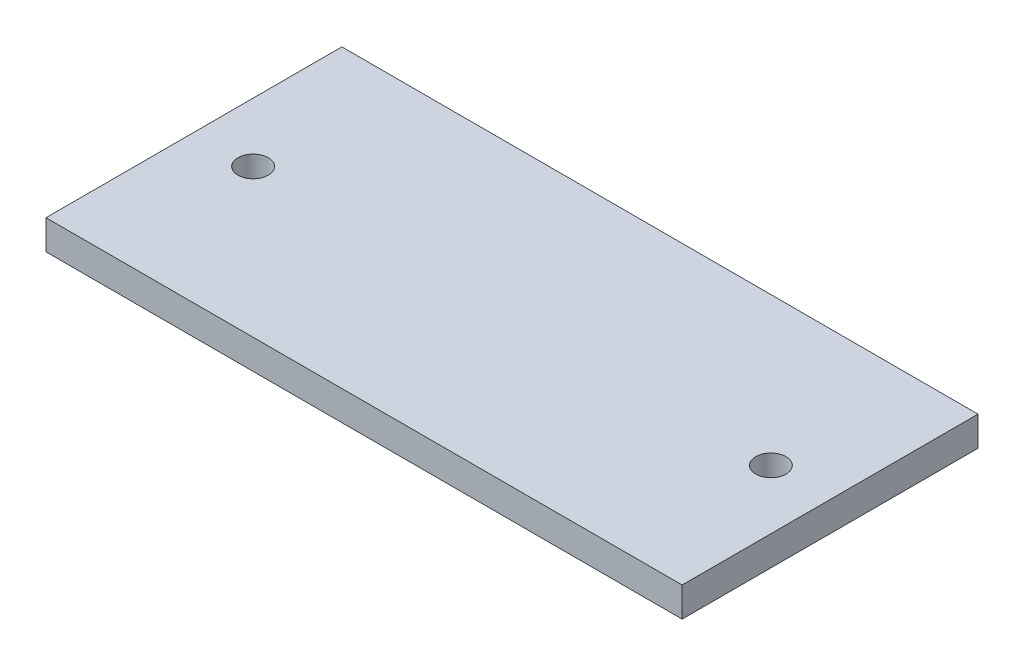
ISO-10303-21;
HEADER;
FILE_DESCRIPTION(('STEP AP214'),'2;1');
FILE_NAME('part.step','',(''),(''),'','','');
FILE_SCHEMA(('AUTOMOTIVE_DESIGN { 1 0 10303 214 1 1 1 1 }'));
ENDSEC;
DATA;
#1=APPLICATION_CONTEXT('core data for automotive mechanical design processes');
#2=APPLICATION_PROTOCOL_DEFINITION('international standard','automotive_design',2000,#1);
#3=PRODUCT_CONTEXT('',#1,'mechanical');
#4=PRODUCT('Part','Part','',(#3));
#5=PRODUCT_RELATED_PRODUCT_CATEGORY('part','',(#4));
#6=PRODUCT_DEFINITION_FORMATION('','',#4);
#7=PRODUCT_DEFINITION_CONTEXT('part definition',#1,'design');
#8=PRODUCT_DEFINITION('design','',#6,#7);
#9=PRODUCT_DEFINITION_SHAPE('','',#8);
#10=(LENGTH_UNIT() NAMED_UNIT(*) SI_UNIT(.MILLI.,.METRE.));
#11=(NAMED_UNIT(*) PLANE_ANGLE_UNIT() SI_UNIT($,.RADIAN.));
#12=(NAMED_UNIT(*) SI_UNIT($,.STERADIAN.) SOLID_ANGLE_UNIT());
#13=UNCERTAINTY_MEASURE_WITH_UNIT(LENGTH_MEASURE(1.E-05),#10,'distance_accuracy_value','');
#14=(GEOMETRIC_REPRESENTATION_CONTEXT(3) GLOBAL_UNCERTAINTY_ASSIGNED_CONTEXT((#13)) GLOBAL_UNIT_ASSIGNED_CONTEXT((#10,
#11,#12)) REPRESENTATION_CONTEXT('',''));
#15=CARTESIAN_POINT('',(0.,0.,0.));
#16=DIRECTION('',(0.,0.,1.));
#17=DIRECTION('',(1.,0.,0.));
#18=AXIS2_PLACEMENT_3D('',#15,#16,#17);
#19=CARTESIAN_POINT('',(0.,2.,0.));
#20=DIRECTION('',(0.,1.,0.));
#21=DIRECTION('',(0.,0.,1.));
#22=AXIS2_PLACEMENT_3D('',#19,#20,#21);
#23=PLANE('',#22);
#24=CARTESIAN_POINT('',(-17.5,2.,0.));
#25=DIRECTION('',(0.,1.,0.));
#26=DIRECTION('',(0.,0.,1.));
#27=AXIS2_PLACEMENT_3D('',#24,#25,#26);
#28=CIRCLE('',#27,1.025);
#29=CARTESIAN_POINT('',(-17.5,2.,1.025));
#30=VERTEX_POINT('',#29);
#31=EDGE_CURVE('E106',#30,#30,#28,.T.);
#32=ORIENTED_EDGE('',*,*,#31,.F.);
#33=EDGE_LOOP('',(#32));
#34=FACE_BOUND('',#33,.T.);
#35=DIRECTION('',(0.,0.,-1.));
#36=VECTOR('',#35,1.);
#37=CARTESIAN_POINT('',(21.5,2.,-10.));
#38=LINE('',#37,#36);
#39=CARTESIAN_POINT('',(21.5,2.,10.));
#40=VERTEX_POINT('',#39);
#41=CARTESIAN_POINT('',(21.5,2.,-10.));
#42=VERTEX_POINT('',#41);
#43=EDGE_CURVE('E91',#40,#42,#38,.T.);
#44=ORIENTED_EDGE('',*,*,#43,.T.);
#45=DIRECTION('',(-1.,0.,0.));
#46=VECTOR('',#45,1.);
#47=CARTESIAN_POINT('',(-21.5,2.,-10.));
#48=LINE('',#47,#46);
#49=CARTESIAN_POINT('',(-21.5,2.,-10.));
#50=VERTEX_POINT('',#49);
#51=EDGE_CURVE('E86',#42,#50,#48,.T.);
#52=ORIENTED_EDGE('',*,*,#51,.T.);
#53=DIRECTION('',(0.,0.,1.));
#54=VECTOR('',#53,1.);
#55=CARTESIAN_POINT('',(-21.5,2.,-10.));
#56=LINE('',#55,#54);
#57=CARTESIAN_POINT('',(-21.5,2.,10.));
#58=VERTEX_POINT('',#57);
#59=EDGE_CURVE('E89',#50,#58,#56,.T.);
#60=ORIENTED_EDGE('',*,*,#59,.T.);
#61=DIRECTION('',(1.,0.,0.));
#62=VECTOR('',#61,1.);
#63=CARTESIAN_POINT('',(-21.5,2.,10.));
#64=LINE('',#63,#62);
#65=EDGE_CURVE('E56',#58,#40,#64,.T.);
#66=ORIENTED_EDGE('',*,*,#65,.T.);
#67=EDGE_LOOP('',(#44,#52,#60,#66));
#68=FACE_BOUND('',#67,.T.);
#69=CARTESIAN_POINT('',(17.5,2.,0.));
#70=DIRECTION('',(0.,1.,0.));
#71=DIRECTION('',(0.,0.,1.));
#72=AXIS2_PLACEMENT_3D('',#69,#70,#71);
#73=CIRCLE('',#72,1.025);
#74=CARTESIAN_POINT('',(17.5,2.,1.02499999999999));
#75=VERTEX_POINT('',#74);
#76=EDGE_CURVE('E121',#75,#75,#73,.T.);
#77=ORIENTED_EDGE('',*,*,#76,.F.);
#78=EDGE_LOOP('',(#77));
#79=FACE_BOUND('',#78,.T.);
#80=ADVANCED_FACE('F39',(#34,#68,#79),#23,.T.);
#81=CARTESIAN_POINT('',(0.,0.,0.));
#82=DIRECTION('',(0.,1.,0.));
#83=DIRECTION('',(0.,0.,1.));
#84=AXIS2_PLACEMENT_3D('',#81,#82,#83);
#85=PLANE('',#84);
#86=DIRECTION('',(0.,0.,-1.));
#87=VECTOR('',#86,1.);
#88=CARTESIAN_POINT('',(21.5,0.,-10.));
#89=LINE('',#88,#87);
#90=CARTESIAN_POINT('',(21.5,0.,10.));
#91=VERTEX_POINT('',#90);
#92=CARTESIAN_POINT('',(21.5,0.,-10.));
#93=VERTEX_POINT('',#92);
#94=EDGE_CURVE('E103',#91,#93,#89,.T.);
#95=ORIENTED_EDGE('',*,*,#94,.F.);
#96=DIRECTION('',(1.,0.,0.));
#97=VECTOR('',#96,1.);
#98=CARTESIAN_POINT('',(-21.5,0.,10.));
#99=LINE('',#98,#97);
#100=CARTESIAN_POINT('',(-21.5,0.,10.));
#101=VERTEX_POINT('',#100);
#102=EDGE_CURVE('E79',#101,#91,#99,.T.);
#103=ORIENTED_EDGE('',*,*,#102,.F.);
#104=DIRECTION('',(0.,0.,1.));
#105=VECTOR('',#104,1.);
#106=CARTESIAN_POINT('',(-21.5,0.,-10.));
#107=LINE('',#106,#105);
#108=CARTESIAN_POINT('',(-21.5,0.,-10.));
#109=VERTEX_POINT('',#108);
#110=EDGE_CURVE('E73',#109,#101,#107,.T.);
#111=ORIENTED_EDGE('',*,*,#110,.F.);
#112=DIRECTION('',(-1.,0.,0.));
#113=VECTOR('',#112,1.);
#114=CARTESIAN_POINT('',(-21.5,0.,-10.));
#115=LINE('',#114,#113);
#116=EDGE_CURVE('E95',#93,#109,#115,.T.);
#117=ORIENTED_EDGE('',*,*,#116,.F.);
#118=EDGE_LOOP('',(#95,#103,#111,#117));
#119=FACE_BOUND('',#118,.T.);
#120=CARTESIAN_POINT('',(-17.5,0.,0.));
#121=DIRECTION('',(0.,1.,0.));
#122=DIRECTION('',(0.,0.,1.));
#123=AXIS2_PLACEMENT_3D('',#120,#121,#122);
#124=CIRCLE('',#123,1.025);
#125=CARTESIAN_POINT('',(-17.5,0.,1.025));
#126=VERTEX_POINT('',#125);
#127=EDGE_CURVE('E118',#126,#126,#124,.T.);
#128=ORIENTED_EDGE('',*,*,#127,.T.);
#129=EDGE_LOOP('',(#128));
#130=FACE_BOUND('',#129,.T.);
#131=CARTESIAN_POINT('',(17.5,0.,0.));
#132=DIRECTION('',(0.,1.,0.));
#133=DIRECTION('',(0.,0.,1.));
#134=AXIS2_PLACEMENT_3D('',#131,#132,#133);
#135=CIRCLE('',#134,1.025);
#136=CARTESIAN_POINT('',(17.5,0.,1.02499999999999));
#137=VERTEX_POINT('',#136);
#138=EDGE_CURVE('E124',#137,#137,#135,.T.);
#139=ORIENTED_EDGE('',*,*,#138,.T.);
#140=EDGE_LOOP('',(#139));
#141=FACE_BOUND('',#140,.T.);
#142=ADVANCED_FACE('F114',(#119,#130,#141),#85,.F.);
#143=CARTESIAN_POINT('',(21.5,2.,-10.));
#144=DIRECTION('',(-1.,0.,0.));
#145=DIRECTION('',(0.,0.,1.));
#146=AXIS2_PLACEMENT_3D('',#143,#144,#145);
#147=PLANE('',#146);
#148=ORIENTED_EDGE('',*,*,#94,.T.);
#149=DIRECTION('',(0.,-1.,0.));
#150=VECTOR('',#149,1.);
#151=CARTESIAN_POINT('',(21.5,2.,-10.));
#152=LINE('',#151,#150);
#153=EDGE_CURVE('E11',#42,#93,#152,.T.);
#154=ORIENTED_EDGE('',*,*,#153,.F.);
#155=ORIENTED_EDGE('',*,*,#43,.F.);
#156=DIRECTION('',(0.,-1.,0.));
#157=VECTOR('',#156,1.);
#158=CARTESIAN_POINT('',(21.5,2.,10.));
#159=LINE('',#158,#157);
#160=EDGE_CURVE('E99',#40,#91,#159,.T.);
#161=ORIENTED_EDGE('',*,*,#160,.T.);
#162=EDGE_LOOP('',(#148,#154,#155,#161));
#163=FACE_BOUND('',#162,.T.);
#164=ADVANCED_FACE('F41',(#163),#147,.F.);
#165=CARTESIAN_POINT('',(-21.5,2.,-10.));
#166=DIRECTION('',(0.,0.,1.));
#167=DIRECTION('',(1.,0.,0.));
#168=AXIS2_PLACEMENT_3D('',#165,#166,#167);
#169=PLANE('',#168);
#170=ORIENTED_EDGE('',*,*,#116,.T.);
#171=DIRECTION('',(0.,-1.,0.));
#172=VECTOR('',#171,1.);
#173=CARTESIAN_POINT('',(-21.5,2.,-10.));
#174=LINE('',#173,#172);
#175=EDGE_CURVE('E48',#50,#109,#174,.T.);
#176=ORIENTED_EDGE('',*,*,#175,.F.);
#177=ORIENTED_EDGE('',*,*,#51,.F.);
#178=ORIENTED_EDGE('',*,*,#153,.T.);
#179=EDGE_LOOP('',(#170,#176,#177,#178));
#180=FACE_BOUND('',#179,.T.);
#181=ADVANCED_FACE('F94',(#180),#169,.F.);
#182=CARTESIAN_POINT('',(-21.5,2.,-10.));
#183=DIRECTION('',(1.,0.,0.));
#184=DIRECTION('',(0.,0.,-1.));
#185=AXIS2_PLACEMENT_3D('',#182,#183,#184);
#186=PLANE('',#185);
#187=ORIENTED_EDGE('',*,*,#110,.T.);
#188=DIRECTION('',(0.,-1.,0.));
#189=VECTOR('',#188,1.);
#190=CARTESIAN_POINT('',(-21.5,2.,10.));
#191=LINE('',#190,#189);
#192=EDGE_CURVE('E96',#58,#101,#191,.T.);
#193=ORIENTED_EDGE('',*,*,#192,.F.);
#194=ORIENTED_EDGE('',*,*,#59,.F.);
#195=ORIENTED_EDGE('',*,*,#175,.T.);
#196=EDGE_LOOP('',(#187,#193,#194,#195));
#197=FACE_BOUND('',#196,.T.);
#198=ADVANCED_FACE('F97',(#197),#186,.F.);
#199=CARTESIAN_POINT('',(-21.5,2.,10.));
#200=DIRECTION('',(0.,0.,-1.));
#201=DIRECTION('',(-1.,0.,0.));
#202=AXIS2_PLACEMENT_3D('',#199,#200,#201);
#203=PLANE('',#202);
#204=ORIENTED_EDGE('',*,*,#102,.T.);
#205=ORIENTED_EDGE('',*,*,#160,.F.);
#206=ORIENTED_EDGE('',*,*,#65,.F.);
#207=ORIENTED_EDGE('',*,*,#192,.T.);
#208=EDGE_LOOP('',(#204,#205,#206,#207));
#209=FACE_BOUND('',#208,.T.);
#210=ADVANCED_FACE('F111',(#209),#203,.F.);
#211=CARTESIAN_POINT('',(-17.5,2.,0.));
#212=DIRECTION('',(0.,-1.,0.));
#213=DIRECTION('',(0.,0.,-1.));
#214=AXIS2_PLACEMENT_3D('',#211,#212,#213);
#215=CYLINDRICAL_SURFACE('',#214,1.025);
#216=ORIENTED_EDGE('',*,*,#31,.T.);
#217=EDGE_LOOP('',(#216));
#218=FACE_BOUND('',#217,.T.);
#219=ORIENTED_EDGE('',*,*,#127,.F.);
#220=EDGE_LOOP('',(#219));
#221=FACE_BOUND('',#220,.T.);
#222=ADVANCED_FACE('F141',(#218,#221),#215,.F.);
#223=CARTESIAN_POINT('',(17.5,2.,0.));
#224=DIRECTION('',(0.,-1.,0.));
#225=DIRECTION('',(0.,0.,-1.));
#226=AXIS2_PLACEMENT_3D('',#223,#224,#225);
#227=CYLINDRICAL_SURFACE('',#226,1.025);
#228=ORIENTED_EDGE('',*,*,#76,.T.);
#229=EDGE_LOOP('',(#228));
#230=FACE_BOUND('',#229,.T.);
#231=ORIENTED_EDGE('',*,*,#138,.F.);
#232=EDGE_LOOP('',(#231));
#233=FACE_BOUND('',#232,.T.);
#234=ADVANCED_FACE('F130',(#230,#233),#227,.F.);
#235=CLOSED_SHELL('',(#80,#142,#164,#181,#198,#210,#222,#234));
#236=MANIFOLD_SOLID_BREP('B2',#235);
#237=ADVANCED_BREP_SHAPE_REPRESENTATION('',(#18,#236),#14);
#238=SHAPE_DEFINITION_REPRESENTATION(#9,#237);
ENDSEC;
END-ISO-10303-21;
